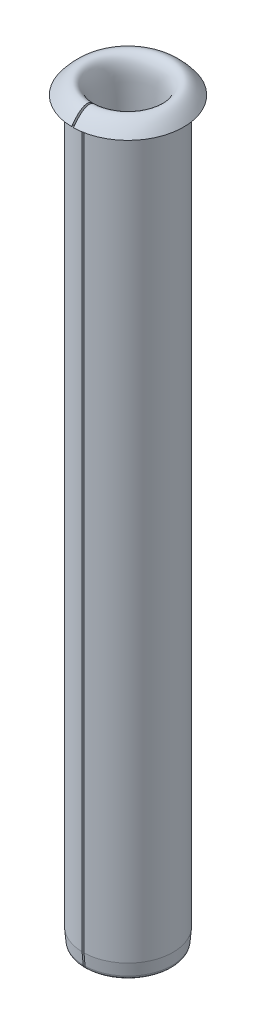
ISO-10303-21;
HEADER;
FILE_DESCRIPTION(('STEP AP214'),'2;1');
FILE_NAME('part.step','',(''),(''),'','','');
FILE_SCHEMA(('AUTOMOTIVE_DESIGN { 1 0 10303 214 1 1 1 1 }'));
ENDSEC;
DATA;
#1=APPLICATION_CONTEXT('core data for automotive mechanical design processes');
#2=APPLICATION_PROTOCOL_DEFINITION('international standard','automotive_design',2000,#1);
#3=PRODUCT_CONTEXT('',#1,'mechanical');
#4=PRODUCT('Part','Part','',(#3));
#5=PRODUCT_RELATED_PRODUCT_CATEGORY('part','',(#4));
#6=PRODUCT_DEFINITION_FORMATION('','',#4);
#7=PRODUCT_DEFINITION_CONTEXT('part definition',#1,'design');
#8=PRODUCT_DEFINITION('design','',#6,#7);
#9=PRODUCT_DEFINITION_SHAPE('','',#8);
#10=(LENGTH_UNIT() NAMED_UNIT(*) SI_UNIT(.MILLI.,.METRE.));
#11=(NAMED_UNIT(*) PLANE_ANGLE_UNIT() SI_UNIT($,.RADIAN.));
#12=(NAMED_UNIT(*) SI_UNIT($,.STERADIAN.) SOLID_ANGLE_UNIT());
#13=UNCERTAINTY_MEASURE_WITH_UNIT(LENGTH_MEASURE(1.E-05),#10,'distance_accuracy_value','');
#14=(GEOMETRIC_REPRESENTATION_CONTEXT(3) GLOBAL_UNCERTAINTY_ASSIGNED_CONTEXT((#13)) GLOBAL_UNIT_ASSIGNED_CONTEXT((#10,
#11,#12)) REPRESENTATION_CONTEXT('',''));
#15=CARTESIAN_POINT('',(0.,0.,0.));
#16=DIRECTION('',(0.,0.,1.));
#17=DIRECTION('',(1.,0.,0.));
#18=AXIS2_PLACEMENT_3D('',#15,#16,#17);
#19=CARTESIAN_POINT('',(0.,25.2095,0.));
#20=DIRECTION('',(0.,1.,0.));
#21=DIRECTION('',(0.,0.,1.));
#22=AXIS2_PLACEMENT_3D('',#19,#20,#21);
#23=CYLINDRICAL_SURFACE('',#22,1.9431);
#24=CARTESIAN_POINT('',(0.,6.0456438407686,0.));
#25=DIRECTION('',(0.,1.,0.));
#26=DIRECTION('',(0.,0.,1.));
#27=AXIS2_PLACEMENT_3D('',#24,#25,#26);
#28=CIRCLE('',#27,1.9431);
#29=CARTESIAN_POINT('',(0.0634999999999994,6.0456438407686,1.94206214112731));
#30=VERTEX_POINT('',#29);
#31=CARTESIAN_POINT('',(-0.0634999999999997,6.0456438407686,1.94206214112731));
#32=VERTEX_POINT('',#31);
#33=EDGE_CURVE('E141',#30,#32,#28,.T.);
#34=ORIENTED_EDGE('',*,*,#33,.T.);
#35=DIRECTION('',(0.,1.,0.));
#36=VECTOR('',#35,1.);
#37=CARTESIAN_POINT('',(-0.0634999999999998,25.2095,1.94206214112731));
#38=LINE('',#37,#36);
#39=CARTESIAN_POINT('',(-0.0634999999999998,-23.0505,1.94206214112731));
#40=VERTEX_POINT('',#39);
#41=EDGE_CURVE('E135',#32,#40,#38,.F.);
#42=ORIENTED_EDGE('',*,*,#41,.T.);
#43=CARTESIAN_POINT('',(0.,-23.0505,0.));
#44=DIRECTION('',(0.,1.,0.));
#45=DIRECTION('',(0.,0.,1.));
#46=AXIS2_PLACEMENT_3D('',#43,#44,#45);
#47=CIRCLE('',#46,1.9431);
#48=CARTESIAN_POINT('',(0.0634999999999998,-23.0505,1.94206214112731));
#49=VERTEX_POINT('',#48);
#50=EDGE_CURVE('E130',#49,#40,#47,.T.);
#51=ORIENTED_EDGE('',*,*,#50,.F.);
#52=DIRECTION('',(0.,1.,0.));
#53=VECTOR('',#52,1.);
#54=CARTESIAN_POINT('',(0.0634999999999998,25.2095,1.94206214112731));
#55=LINE('',#54,#53);
#56=EDGE_CURVE('E218',#49,#30,#55,.T.);
#57=ORIENTED_EDGE('',*,*,#56,.T.);
#58=EDGE_LOOP('',(#34,#42,#51,#57));
#59=FACE_BOUND('',#58,.T.);
#60=ADVANCED_FACE('F38',(#59),#23,.F.);
#61=CARTESIAN_POINT('',(0.,25.2095,-3.65125000000001));
#62=CARTESIAN_POINT('',(0.,26.5305018450348,-2.65729724700705));
#63=CARTESIAN_POINT('',(0.,25.8912896436103,-1.95569800395502));
#64=CARTESIAN_POINT('',(0.,23.1640789110681,-1.89109679939676));
#65=CARTESIAN_POINT('',(0.,10.0917514319737,-1.9431));
#66=CARTESIAN_POINT('',(0.,6.0456438407686,-1.9431));
#67=B_SPLINE_CURVE_WITH_KNOTS('',3,(#61,#62,#63,#64,#65,#66),.UNSPECIFIED.,.F.,.F.,(4,1,1,4),
(0.,0.384568444364939,0.484568444364939,1.),.UNSPECIFIED.);
#68=CARTESIAN_POINT('',(0.,25.2095,0.));
#69=DIRECTION('',(0.,1.,0.));
#70=AXIS1_PLACEMENT('',#68,#69);
#71=SURFACE_OF_REVOLUTION('',#67,#70);
#72=CARTESIAN_POINT('',(0.,25.2095,0.));
#73=DIRECTION('',(0.,1.,0.));
#74=DIRECTION('',(0.,0.,1.));
#75=AXIS2_PLACEMENT_3D('',#72,#73,#74);
#76=CIRCLE('',#75,3.65125000000001);
#77=CARTESIAN_POINT('',(0.0634999999999996,25.2095,3.65069778432837));
#78=VERTEX_POINT('',#77);
#79=CARTESIAN_POINT('',(-0.0634999999999996,25.2095,3.65069778432837));
#80=VERTEX_POINT('',#79);
#81=EDGE_CURVE('E132',#78,#80,#76,.T.);
#82=ORIENTED_EDGE('',*,*,#81,.T.);
#83=CARTESIAN_POINT('',(-0.0634999999999995,25.2095,3.65069778432837));
#84=CARTESIAN_POINT('',(-0.0634999999999995,25.2525849524079,3.61825117880372));
#85=CARTESIAN_POINT('',(-0.0634999999999996,25.2952226298447,3.5851866480371));
#86=CARTESIAN_POINT('',(-0.0634999999999996,25.3793649829865,3.51750900977395));
#87=CARTESIAN_POINT('',(-0.0634999999999996,25.4208676492833,3.48289341019141));
#88=CARTESIAN_POINT('',(-0.0634999999999996,25.5028989088239,3.4114342518473));
#89=CARTESIAN_POINT('',(-0.0634999999999996,25.5434071368236,3.37456714125441));
#90=CARTESIAN_POINT('',(-0.0634999999999996,25.6223281363604,3.29867997139376));
#91=CARTESIAN_POINT('',(-0.0634999999999997,25.6607421410328,3.25966120691164));
#92=CARTESIAN_POINT('',(-0.0634999999999998,25.7356207297132,3.17797016502465));
#93=CARTESIAN_POINT('',(-0.0634999999999998,25.7720134822132,3.13523134119888));
#94=CARTESIAN_POINT('',(-0.0634999999999995,25.8403306388767,3.04633730637982));
#95=CARTESIAN_POINT('',(-0.0634999999999991,25.8722632873164,3.00018864646711));
#96=CARTESIAN_POINT('',(-0.0634999999999992,25.9211540862807,2.91721765149556));
#97=CARTESIAN_POINT('',(-0.0634999999999995,25.9398009691219,2.88140544507021));
#98=CARTESIAN_POINT('',(-0.0634999999999998,25.971820238451,2.80743952086338));
#99=CARTESIAN_POINT('',(-0.0634999999999997,25.9852010817098,2.76928967194772));
#100=CARTESIAN_POINT('',(-0.0634999999999996,26.0011972019755,2.70386266707454));
#101=CARTESIAN_POINT('',(-0.0634999999999995,26.0059018201129,2.67710807746424));
#102=CARTESIAN_POINT('',(-0.0634999999999998,26.0109991786346,2.62322490734176));
#103=CARTESIAN_POINT('',(-0.0635000000000001,26.0114040857448,2.59609759971822));
#104=CARTESIAN_POINT('',(-0.0635000000000001,26.0072462853658,2.54192199657905));
#105=CARTESIAN_POINT('',(-0.0634999999999997,26.002633906891,2.5148771982149));
#106=CARTESIAN_POINT('',(-0.0634999999999997,25.9882439843716,2.46219860173665));
#107=CARTESIAN_POINT('',(-0.0635000000000002,25.9784672596926,2.43656458050346));
#108=CARTESIAN_POINT('',(-0.0635000000000001,25.9557863367476,2.39046939441756));
#109=CARTESIAN_POINT('',(-0.0634999999999996,25.9433866688396,2.36975465728549));
#110=CARTESIAN_POINT('',(-0.0634999999999998,25.9156963805078,2.33033224860946));
#111=CARTESIAN_POINT('',(-0.0635000000000005,25.9004012088773,2.31162781044834));
#112=CARTESIAN_POINT('',(-0.0635000000000004,25.870610702169,2.27951660875044));
#113=CARTESIAN_POINT('',(-0.0634999999999999,25.8564789726489,2.26576604256169));
#114=CARTESIAN_POINT('',(-0.0634999999999996,25.8270710059672,2.23958353453351));
#115=CARTESIAN_POINT('',(-0.0634999999999997,25.8117956502125,2.22715059467739));
#116=CARTESIAN_POINT('',(-0.0634999999999998,25.764535992816,2.19159190196874));
#117=CARTESIAN_POINT('',(-0.0634999999999996,25.7311868042261,2.17027654538413));
#118=CARTESIAN_POINT('',(-0.0634999999999995,25.6646186535501,2.13292443055379));
#119=CARTESIAN_POINT('',(-0.0634999999999997,25.631538040991,2.1166311739588));
#120=CARTESIAN_POINT('',(-0.0634999999999998,25.5640947720004,2.08688820051919));
#121=CARTESIAN_POINT('',(-0.0634999999999997,25.5297308630719,2.07344135186749));
#122=CARTESIAN_POINT('',(-0.0634999999999998,25.4600983263685,2.04892036747279));
#123=CARTESIAN_POINT('',(-0.0634999999999998,25.4248279283881,2.03785134360309));
#124=CARTESIAN_POINT('',(-0.0634999999999997,25.3537487796787,2.01777228881008));
#125=CARTESIAN_POINT('',(-0.0634999999999994,25.3179405698892,2.00876031966933));
#126=CARTESIAN_POINT('',(-0.0634999999999993,25.2380877277927,1.99074216630333));
#127=CARTESIAN_POINT('',(-0.0634999999999996,25.1939471145982,1.98216435869941));
#128=CARTESIAN_POINT('',(-0.0634999999999999,25.1052828108305,1.96726885746163));
#129=CARTESIAN_POINT('',(-0.0634999999999998,25.0607590409379,1.96095164392075));
#130=CARTESIAN_POINT('',(-0.0634999999999997,24.9713451488683,1.95034263206063));
#131=CARTESIAN_POINT('',(-0.0634999999999998,24.9264543395727,1.94605674425729));
#132=CARTESIAN_POINT('',(-0.0634999999999998,24.8365589307472,1.93902373514264));
#133=CARTESIAN_POINT('',(-0.0634999999999998,24.791554330034,1.93627662989744));
#134=CARTESIAN_POINT('',(-0.0634999999999998,24.7013981664918,1.9317706119025));
#135=CARTESIAN_POINT('',(-0.0634999999999998,24.6562465000686,1.93001392255642));
#136=CARTESIAN_POINT('',(-0.0634999999999998,24.5659256823257,1.92712303516122));
#137=CARTESIAN_POINT('',(-0.0634999999999998,24.5207565314535,1.92598882211287));
#138=CARTESIAN_POINT('',(-0.0634999999999998,24.3846555123278,1.92312565913346));
#139=CARTESIAN_POINT('',(-0.0634999999999998,24.2937127943944,1.92195797122578));
#140=CARTESIAN_POINT('',(-0.0634999999999998,24.1120349372313,1.92011850755025));
#141=CARTESIAN_POINT('',(-0.0634999999999998,24.021299804374,1.91944559107397));
#142=CARTESIAN_POINT('',(-0.0634999999999997,23.83991356424,1.91828148212774));
#143=CARTESIAN_POINT('',(-0.0634999999999995,23.7492624583271,1.91779011906913));
#144=CARTESIAN_POINT('',(-0.0634999999999991,23.3911754467131,1.9160897124077));
#145=CARTESIAN_POINT('',(-0.0634999999999996,23.1237376046809,1.91534978688922));
#146=CARTESIAN_POINT('',(-0.0634999999999999,22.5886398562582,1.91430458782529));
#147=CARTESIAN_POINT('',(-0.0634999999999998,22.320979949411,1.91399967480046));
#148=CARTESIAN_POINT('',(-0.0634999999999997,21.7855404400794,1.91366661833519));
#149=CARTESIAN_POINT('',(-0.0634999999999998,21.5177608375137,1.91363859853684));
#150=CARTESIAN_POINT('',(-0.0634999999999998,20.9821847515862,1.91376224115333));
#151=CARTESIAN_POINT('',(-0.0634999999999998,20.7143882682289,1.91391391494288));
#152=CARTESIAN_POINT('',(-0.0634999999999998,20.1802428983414,1.91434651629273));
#153=CARTESIAN_POINT('',(-0.0634999999999998,19.9138940112303,1.91462674078128));
#154=CARTESIAN_POINT('',(-0.0634999999999998,19.3812556738536,1.91528353444951));
#155=CARTESIAN_POINT('',(-0.0634999999999998,19.1149662235604,1.91566008216014));
#156=CARTESIAN_POINT('',(-0.0634999999999998,18.5824213337061,1.91648750278594));
#157=CARTESIAN_POINT('',(-0.0634999999999997,18.31616589413,1.91693836623478));
#158=CARTESIAN_POINT('',(-0.0634999999999998,17.7836636120618,1.91789836924967));
#159=CARTESIAN_POINT('',(-0.0634999999999999,17.5174167695663,1.91840750695684));
#160=CARTESIAN_POINT('',(-0.0635000000000001,16.6295029362049,1.9201809101271));
#161=CARTESIAN_POINT('',(-0.0634999999999999,16.0078361478196,1.92154591684627));
#162=CARTESIAN_POINT('',(-0.0634999999999997,14.7644501030037,1.92440676920792));
#163=CARTESIAN_POINT('',(-0.0634999999999998,14.1427308465996,1.92590262594889));
#164=CARTESIAN_POINT('',(-0.0634999999999998,12.8992789874935,1.92893677110839));
#165=CARTESIAN_POINT('',(-0.0634999999999998,12.2775463847936,1.93047506044404));
#166=CARTESIAN_POINT('',(-0.0634999999999998,11.0333152802993,1.93349906561809));
#167=CARTESIAN_POINT('',(-0.0634999999999999,10.4108167783492,1.93498471436939));
#168=CARTESIAN_POINT('',(-0.0634999999999997,9.16583274386796,1.93777194362577));
#169=CARTESIAN_POINT('',(-0.0634999999999994,8.54334721134674,1.93907352810096));
#170=CARTESIAN_POINT('',(-0.0634999999999999,7.60961846748299,1.94064911035104));
#171=CARTESIAN_POINT('',(-0.0635000000000003,7.29837557614109,1.94111150527148));
#172=CARTESIAN_POINT('',(-0.0634999999999993,6.67588954642258,1.94181593544022));
#173=CARTESIAN_POINT('',(-0.0634999999999979,6.36464640804604,1.94205797074307));
#174=CARTESIAN_POINT('',(-0.0634999999999996,6.05081678360277,1.94206212206388));
#175=CARTESIAN_POINT('',(-0.0634999999999996,6.04823031218615,1.94206213984736));
#176=CARTESIAN_POINT('',(-0.0634999999999996,6.0456438407686,1.94206214112731));
#177=B_SPLINE_CURVE_WITH_KNOTS('',3,(#83,#84,#85,#86,#87,#88,#89,#90,#91,#92,#93,#94,#95,#96,
#97,#98,#99,#100,#101,#102,#103,#104,#105,#106,#107,#108,#109,#110,#111,#112,#113,#114,#115,
#116,#117,#118,#119,#120,#121,#122,#123,#124,#125,#126,#127,#128,#129,#130,#131,#132,#133,#134,
#135,#136,#137,#138,#139,#140,#141,#142,#143,#144,#145,#146,#147,#148,#149,#150,#151,#152,#153,
#154,#155,#156,#157,#158,#159,#160,#161,#162,#163,#164,#165,#166,#167,#168,#169,#170,#171,#172,
#173,#174,#175,#176),.UNSPECIFIED.,.F.,.F.,(4,2,2,2,2,2,2,2,2,2,2,2,2,2,2,2,2,2,2,2,2,2,2,2,2,2,
2,2,2,2,2,2,2,2,2,2,2,2,2,2,2,2,2,2,2,2,4),(0.,0.161824296279905,0.323918633957974,
0.488174178949798,0.652331937362808,0.820554832350032,0.98846253983193,1.10932109193161,
1.22998475659452,1.3112033054825,1.39219197194098,1.47398978201144,1.55577461808952,
1.62791851627714,1.70017676754837,1.75924560817448,1.81826938330553,1.93660830891603,
2.04709059457147,2.15768368364099,2.26851219889892,2.37923585319993,2.51406433946752,
2.64892144292365,2.78416856489701,2.91941709893177,3.05496805822672,3.19051575113524,
3.46336022135094,3.73557365195228,4.00753065481241,4.80984626486723,5.61282641588422,
6.41616510815538,7.21955465498008,8.01860173328563,8.81747087046271,9.61623832617934,
10.4149803092783,12.2799851356634,14.1451483026871,16.0103518148328,17.8778526521344,
19.7453132029441,20.6790428935909,21.612772353051,21.620531767301),.UNSPECIFIED.);
#178=EDGE_CURVE('E187',#80,#32,#177,.T.);
#179=ORIENTED_EDGE('',*,*,#178,.T.);
#180=ORIENTED_EDGE('',*,*,#33,.F.);
#181=CARTESIAN_POINT('',(0.0634999999999994,6.0456438407686,1.94206214112731));
#182=CARTESIAN_POINT('',(0.0634999999999996,6.26142839064168,1.94205191839322));
#183=CARTESIAN_POINT('',(0.0634999999999997,6.47721288923427,1.94194044557862));
#184=CARTESIAN_POINT('',(0.0634999999999998,6.90879322370111,1.94157355286978));
#185=CARTESIAN_POINT('',(0.0634999999999998,7.1245890595692,1.94131812533561));
#186=CARTESIAN_POINT('',(0.0634999999999998,7.55618635058453,1.94072188184621));
#187=CARTESIAN_POINT('',(0.0634999999999998,7.77198780572833,1.94038106361655));
#188=CARTESIAN_POINT('',(0.0634999999999998,8.20315945125013,1.93963905837296));
#189=CARTESIAN_POINT('',(0.0634999999999998,8.41852964183793,1.9392379933331));
#190=CARTESIAN_POINT('',(0.0634999999999998,8.84926416643666,1.93839302559264));
#191=CARTESIAN_POINT('',(0.0634999999999998,9.06462850044988,1.9379491240402));
#192=CARTESIAN_POINT('',(0.0634999999999998,9.49534554722425,1.93703017584061));
#193=CARTESIAN_POINT('',(0.0634999999999998,9.71069825998898,1.9365551308657));
#194=CARTESIAN_POINT('',(0.0634999999999998,10.2438275043666,1.93535159216942));
#195=CARTESIAN_POINT('',(0.0634999999999998,10.5616040062742,1.93461001315689));
#196=CARTESIAN_POINT('',(0.0634999999999997,11.1971570935871,1.93309938792824));
#197=CARTESIAN_POINT('',(0.0634999999999998,11.5149336789924,1.9323303416992));
#198=CARTESIAN_POINT('',(0.0634999999999998,12.1505249861725,1.93078041806093));
#199=CARTESIAN_POINT('',(0.0634999999999998,12.4683397079437,1.92999953924187));
#200=CARTESIAN_POINT('',(0.0634999999999998,13.1040453342009,1.92843909613716));
#201=CARTESIAN_POINT('',(0.0634999999999998,13.4219362386877,1.92765953221146));
#202=CARTESIAN_POINT('',(0.0634999999999998,14.0588204438893,1.92611130484138));
#203=CARTESIAN_POINT('',(0.0634999999999998,14.3778137447194,1.92534268857145));
#204=CARTESIAN_POINT('',(0.0634999999999998,15.0157813781239,1.9238312762827));
#205=CARTESIAN_POINT('',(0.0634999999999998,15.3347557106947,1.92308847872628));
#206=CARTESIAN_POINT('',(0.0634999999999998,15.9725516198698,1.92164197665789));
#207=CARTESIAN_POINT('',(0.0634999999999998,16.2913731964319,1.92093825358409));
#208=CARTESIAN_POINT('',(0.0634999999999997,16.9287298107224,1.91958498239687));
#209=CARTESIAN_POINT('',(0.0634999999999997,17.2472648483476,1.91893538614341));
#210=CARTESIAN_POINT('',(0.0634999999999997,17.7786914939258,1.91791164565359));
#211=CARTESIAN_POINT('',(0.0634999999999997,17.9915830634393,1.91751759864989));
#212=CARTESIAN_POINT('',(0.0634999999999998,18.4173264573173,1.91676864742645));
#213=CARTESIAN_POINT('',(0.0634999999999998,18.6301782816688,1.91641373590011));
#214=CARTESIAN_POINT('',(0.0634999999999998,19.0559891710489,1.91575129292527));
#215=CARTESIAN_POINT('',(0.0634999999999998,19.268948236115,1.91544378542151));
#216=CARTESIAN_POINT('',(0.0634999999999998,19.6951205964093,1.9148869625135));
#217=CARTESIAN_POINT('',(0.0634999999999998,19.9083338917301,1.91463771699563));
#218=CARTESIAN_POINT('',(0.0634999999999998,20.3351617071919,1.91421213030313));
#219=CARTESIAN_POINT('',(0.0634999999999998,20.5487762274739,1.91403592717659));
#220=CARTESIAN_POINT('',(0.0634999999999998,20.9765534981113,1.9137772531788));
#221=CARTESIAN_POINT('',(0.0634999999999998,21.1907162486241,1.91369502399973));
#222=CARTESIAN_POINT('',(0.0634999999999998,21.6173445732125,1.91365621192292));
#223=CARTESIAN_POINT('',(0.0634999999999998,21.8298101471612,1.91369863847034));
#224=CARTESIAN_POINT('',(0.0634999999999998,22.2548673283202,1.91395432536414));
#225=CARTESIAN_POINT('',(0.0634999999999998,22.4674589354843,1.91416768709569));
#226=CARTESIAN_POINT('',(0.0634999999999998,22.7861754975254,1.91468250933342));
#227=CARTESIAN_POINT('',(0.0634999999999998,22.8923006039213,1.91488633804314));
#228=CARTESIAN_POINT('',(0.0634999999999998,23.1045585602737,1.91537955491552));
#229=CARTESIAN_POINT('',(0.0634999999999998,23.2106914102147,1.91566894948504));
#230=CARTESIAN_POINT('',(0.0634999999999998,23.4225707626645,1.91635852820717));
#231=CARTESIAN_POINT('',(0.0634999999999998,23.5283172662837,1.91675830555074));
#232=CARTESIAN_POINT('',(0.0634999999999998,23.7397796751577,1.91773272725248));
#233=CARTESIAN_POINT('',(0.0634999999999998,23.8454955806723,1.91830732251194));
#234=CARTESIAN_POINT('',(0.0634999999999998,24.0562537508886,1.91968573396833));
#235=CARTESIAN_POINT('',(0.0634999999999998,24.1612960213422,1.92048806821929));
#236=CARTESIAN_POINT('',(0.0634999999999998,24.3189110351805,1.92235634345558));
#237=CARTESIAN_POINT('',(0.0634999999999998,24.3714873701586,1.92309049394019));
#238=CARTESIAN_POINT('',(0.0634999999999998,24.4766320782228,1.92498213330282));
#239=CARTESIAN_POINT('',(0.0634999999999998,24.5292004514474,1.92613961368965));
#240=CARTESIAN_POINT('',(0.0634999999999998,24.6341096880838,1.92919841755265));
#241=CARTESIAN_POINT('',(0.0634999999999998,24.6864506308347,1.93109678829574));
#242=CARTESIAN_POINT('',(0.0634999999999998,24.7910785113376,1.93618944092617));
#243=CARTESIAN_POINT('',(0.0634999999999998,24.8433654463715,1.93938378513094));
#244=CARTESIAN_POINT('',(0.0634999999999997,24.947666763851,1.94793731143381));
#245=CARTESIAN_POINT('',(0.0634999999999996,24.999681483895,1.95329209346519));
#246=CARTESIAN_POINT('',(0.0634999999999999,25.1033306348079,1.96685643207269));
#247=CARTESIAN_POINT('',(0.0635000000000003,25.1549651923697,1.97506498912529));
#248=CARTESIAN_POINT('',(0.0635000000000002,25.2459655011043,1.9924848798767));
#249=CARTESIAN_POINT('',(0.0634999999999999,25.2854555677648,2.00104559334645));
#250=CARTESIAN_POINT('',(0.0634999999999996,25.3639009571113,2.02041602631641));
#251=CARTESIAN_POINT('',(0.0634999999999997,25.4028561299798,2.03122636274389));
#252=CARTESIAN_POINT('',(0.0634999999999998,25.4796374711998,2.05539388410212));
#253=CARTESIAN_POINT('',(0.0634999999999997,25.5174701707079,2.06873004400392));
#254=CARTESIAN_POINT('',(0.0634999999999998,25.5918826107723,2.09852800129229));
#255=CARTESIAN_POINT('',(0.0634999999999999,25.6284631888146,2.11498765931306));
#256=CARTESIAN_POINT('',(0.0634999999999999,25.6941245222759,2.14888170084357));
#257=CARTESIAN_POINT('',(0.0634999999999998,25.7234860016539,2.16576499228166));
#258=CARTESIAN_POINT('',(0.0634999999999996,25.7801936194125,2.20285786951519));
#259=CARTESIAN_POINT('',(0.0634999999999995,25.8075337797988,2.22307679187564));
#260=CARTESIAN_POINT('',(0.0634999999999995,25.8593412016956,2.26767036354344));
#261=CARTESIAN_POINT('',(0.0634999999999996,25.8837631535031,2.29209896392457));
#262=CARTESIAN_POINT('',(0.0634999999999998,25.9274377135438,2.34516475580662));
#263=CARTESIAN_POINT('',(0.0635,25.9467132234815,2.37378239386048));
#264=CARTESIAN_POINT('',(0.0634999999999999,25.9736141600363,2.42580063425303));
#265=CARTESIAN_POINT('',(0.0634999999999998,25.9829975861474,2.44829348819886));
#266=CARTESIAN_POINT('',(0.0634999999999996,25.9977553303156,2.49456826325224));
#267=CARTESIAN_POINT('',(0.0634999999999994,26.0031296336511,2.51835018909294));
#268=CARTESIAN_POINT('',(0.0634999999999995,26.0097881315932,2.56637746769456));
#269=CARTESIAN_POINT('',(0.0634999999999997,26.011086643669,2.59062089656799));
#270=CARTESIAN_POINT('',(0.0634999999999996,26.0099893349643,2.63904367064995));
#271=CARTESIAN_POINT('',(0.0634999999999992,26.0075871761546,2.66322283471215));
#272=CARTESIAN_POINT('',(0.0634999999999992,26.0005310194621,2.70572657852547));
#273=CARTESIAN_POINT('',(0.0634999999999995,25.9964946557931,2.72416020305386));
#274=CARTESIAN_POINT('',(0.0634999999999998,25.9868084188891,2.76057518304673));
#275=CARTESIAN_POINT('',(0.0634999999999997,25.9811599410521,2.77855691507324));
#276=CARTESIAN_POINT('',(0.0634999999999995,25.9621428901579,2.83186821025163));
#277=CARTESIAN_POINT('',(0.0634999999999993,25.9467213781844,2.86646696740451));
#278=CARTESIAN_POINT('',(0.0634999999999994,25.9128657763392,2.93207047729133));
#279=CARTESIAN_POINT('',(0.0634999999999996,25.8946030171072,2.96316735437221));
#280=CARTESIAN_POINT('',(0.0634999999999997,25.8555197125399,3.02373317569636));
#281=CARTESIAN_POINT('',(0.0634999999999997,25.8346968712834,3.05320062380452));
#282=CARTESIAN_POINT('',(0.0634999999999996,25.7910447706926,3.11081194188255));
#283=CARTESIAN_POINT('',(0.0634999999999995,25.7682064963171,3.13894890042186));
#284=CARTESIAN_POINT('',(0.0634999999999998,25.721043156095,3.19395230671774));
#285=CARTESIAN_POINT('',(0.0635000000000002,25.6967176588511,3.2208183817837));
#286=CARTESIAN_POINT('',(0.0635000000000004,25.6362241286939,3.28471792915157));
#287=CARTESIAN_POINT('',(0.0634999999999998,25.5994484635684,3.32117456952873));
#288=CARTESIAN_POINT('',(0.0634999999999994,25.5241207924662,3.39222881937241));
#289=CARTESIAN_POINT('',(0.0634999999999995,25.4855677862151,3.42682535766596));
#290=CARTESIAN_POINT('',(0.0634999999999996,25.4079654975923,3.49370287922068));
#291=CARTESIAN_POINT('',(0.0634999999999995,25.3689453899934,3.52601791252398));
#292=CARTESIAN_POINT('',(0.0634999999999996,25.2899149435186,3.58930197614371));
#293=CARTESIAN_POINT('',(0.0634999999999997,25.249906049678,3.62027280721739));
#294=CARTESIAN_POINT('',(0.0635000000000002,25.2095,3.65069778432837));
#295=B_SPLINE_CURVE_WITH_KNOTS('',3,(#181,#182,#183,#184,#185,#186,#187,#188,#189,#190,#191,
#192,#193,#194,#195,#196,#197,#198,#199,#200,#201,#202,#203,#204,#205,#206,#207,#208,#209,#210,
#211,#212,#213,#214,#215,#216,#217,#218,#219,#220,#221,#222,#223,#224,#225,#226,#227,#228,#229,
#230,#231,#232,#233,#234,#235,#236,#237,#238,#239,#240,#241,#242,#243,#244,#245,#246,#247,#248,
#249,#250,#251,#252,#253,#254,#255,#256,#257,#258,#259,#260,#261,#262,#263,#264,#265,#266,#267,
#268,#269,#270,#271,#272,#273,#274,#275,#276,#277,#278,#279,#280,#281,#282,#283,#284,#285,#286,
#287,#288,#289,#290,#291,#292,#293,#294),.UNSPECIFIED.,.F.,.F.,(4,2,2,2,2,2,2,2,2,2,2,2,2,2,2,2,
2,2,2,2,2,2,2,2,2,2,2,2,2,2,2,2,2,2,2,2,2,2,2,2,2,2,2,2,2,2,2,2,2,2,2,2,2,2,2,2,4),(0.,
0.647353561046854,1.29474148150864,1.94214664729908,2.58825833221972,3.23435270404255,
3.88041241252025,4.83374451170952,5.7870770592595,6.74052410250829,7.69419968350228,
8.65118236341234,9.60810795413671,10.5645750107614,11.5201821040428,12.1588579037902,
12.7974142601725,13.4362921150221,14.0759324280112,14.7167761915527,15.3592644619764,
15.9966611548767,16.6344361809753,16.9528120554031,17.2712117746863,17.5884533634236,
17.9056059349858,18.2207402648713,18.3784838322096,18.5362242356854,18.6933422991795,
18.8504679186597,19.0072751299618,19.1640274753904,19.2851966673964,19.4063991322324,
19.5266338321926,19.64678647556,19.7482253611895,19.8499531516997,19.9530975905711,
20.0557750824146,20.1285506760304,20.2013265368791,20.2738464623919,20.3464907287784,
20.4030224634179,20.4595054135073,20.5727638762202,20.6808093794262,20.7889524961642,
20.8976065651428,21.0062923022118,21.1615551279921,21.31690642749,21.4688686416659,
21.6206205658776),.UNSPECIFIED.);
#296=EDGE_CURVE('E210',#30,#78,#295,.T.);
#297=ORIENTED_EDGE('',*,*,#296,.T.);
#298=EDGE_LOOP('',(#82,#179,#180,#297));
#299=FACE_BOUND('',#298,.T.);
#300=ADVANCED_FACE('F196',(#299),#71,.T.);
#301=CARTESIAN_POINT('',(0.,25.2095,-3.20458453955676));
#302=DIRECTION('',(0.,1.,0.));
#303=DIRECTION('',(0.,0.,1.));
#304=AXIS2_PLACEMENT_3D('',#301,#302,#303);
#305=PLANE('',#304);
#306=CARTESIAN_POINT('',(0.,25.2095,0.));
#307=DIRECTION('',(0.,1.,0.));
#308=DIRECTION('',(0.,0.,1.));
#309=AXIS2_PLACEMENT_3D('',#306,#307,#308);
#310=CIRCLE('',#309,3.20458453955676);
#311=CARTESIAN_POINT('',(0.0634999999999996,25.2095000000205,3.20395534006758));
#312=VERTEX_POINT('',#311);
#313=CARTESIAN_POINT('',(-0.0634999999999996,25.2095,3.20395534007048));
#314=VERTEX_POINT('',#313);
#315=EDGE_CURVE('E123',#312,#314,#310,.T.);
#316=ORIENTED_EDGE('',*,*,#315,.T.);
#317=DIRECTION('',(0.,0.,1.));
#318=VECTOR('',#317,1.);
#319=CARTESIAN_POINT('',(-0.0635000000000004,25.2095,-3.20458453955676));
#320=LINE('',#319,#318);
#321=EDGE_CURVE('E195',#314,#80,#320,.T.);
#322=ORIENTED_EDGE('',*,*,#321,.T.);
#323=ORIENTED_EDGE('',*,*,#81,.F.);
#324=DIRECTION('',(0.,0.,-1.));
#325=VECTOR('',#324,1.);
#326=CARTESIAN_POINT('',(0.0635000000000004,25.2095,-3.20458453955676));
#327=LINE('',#326,#325);
#328=EDGE_CURVE('E124',#78,#312,#327,.T.);
#329=ORIENTED_EDGE('',*,*,#328,.T.);
#330=EDGE_LOOP('',(#316,#322,#323,#329));
#331=FACE_BOUND('',#330,.T.);
#332=ADVANCED_FACE('F200',(#331),#305,.F.);
#333=CARTESIAN_POINT('',(0.,24.9555,0.));
#334=DIRECTION('',(0.,1.,0.));
#335=DIRECTION('',(0.,0.,1.));
#336=AXIS2_PLACEMENT_3D('',#333,#334,#335);
#337=TOROIDAL_SURFACE('',#336,3.20458453955676,0.254);
#338=CARTESIAN_POINT('',(0.,24.9555,0.));
#339=DIRECTION('',(0.,1.,0.));
#340=DIRECTION('',(0.,0.,1.));
#341=AXIS2_PLACEMENT_3D('',#338,#339,#340);
#342=CIRCLE('',#341,2.95058453955676);
#343=CARTESIAN_POINT('',(0.0634999999999996,24.9555,2.94990116361063));
#344=VERTEX_POINT('',#343);
#345=CARTESIAN_POINT('',(-0.0634999999999996,24.9555,2.94990116361063));
#346=VERTEX_POINT('',#345);
#347=EDGE_CURVE('E121',#344,#346,#342,.T.);
#348=ORIENTED_EDGE('',*,*,#347,.T.);
#349=CARTESIAN_POINT('',(-0.0634999999999996,25.0081375151706,2.955416439005));
#350=CARTESIAN_POINT('',(-0.0634999999999996,25.022093788553,2.95837416696398));
#351=CARTESIAN_POINT('',(-0.0634999999999996,25.0358104296924,2.96251280714055));
#352=CARTESIAN_POINT('',(-0.0634999999999996,25.0623654268699,2.97303807599447));
#353=CARTESIAN_POINT('',(-0.0634999999999996,25.0752027040794,2.97942740890873));
#354=CARTESIAN_POINT('',(-0.0634999999999996,25.0996170470811,2.99426840641064));
#355=CARTESIAN_POINT('',(-0.0634999999999996,25.1111947215229,3.00271906849099));
#356=CARTESIAN_POINT('',(-0.0634999999999996,25.132763978181,3.02144168115919));
#357=CARTESIAN_POINT('',(-0.0634999999999996,25.1427559532012,3.03171317935704));
#358=CARTESIAN_POINT('',(-0.0634999999999996,25.1608768133097,3.05379017064003));
#359=CARTESIAN_POINT('',(-0.0634999999999996,25.1690052277993,3.06559605002047));
#360=CARTESIAN_POINT('',(-0.0634999999999996,25.1831654166182,3.09040512543139));
#361=CARTESIAN_POINT('',(-0.0634999999999996,25.1891971062721,3.1034083697901));
#362=CARTESIAN_POINT('',(-0.0634999999999996,25.1989933513294,3.13024524931404));
#363=CARTESIAN_POINT('',(-0.0634999999999996,25.2027574872211,3.14407903761481));
#364=CARTESIAN_POINT('',(-0.0634999999999996,25.2079101197101,3.1721821552278));
#365=CARTESIAN_POINT('',(-0.0634999999999996,25.2092986192238,3.18645148400529));
#366=CARTESIAN_POINT('',(-0.0634999999999996,25.2096606148805,3.21502236651515));
#367=CARTESIAN_POINT('',(-0.0634999999999996,25.2086338376143,3.22932392371269));
#368=CARTESIAN_POINT('',(-0.0634999999999996,25.2041937884572,3.25755163634632));
#369=CARTESIAN_POINT('',(-0.0634999999999996,25.2007805207059,3.27147779243356));
#370=CARTESIAN_POINT('',(-0.0634999999999996,25.1916643507719,3.2985590789059));
#371=CARTESIAN_POINT('',(-0.0634999999999996,25.1859614929289,3.31171422421664));
#372=CARTESIAN_POINT('',(-0.0634999999999996,25.1724278813424,3.33688021170918));
#373=CARTESIAN_POINT('',(-0.0634999999999996,25.1645971265421,3.34889105332269));
#374=CARTESIAN_POINT('',(-0.0634999999999996,25.1470310433673,3.37142578912795));
#375=CARTESIAN_POINT('',(-0.0634999999999996,25.1372959586088,3.38194987322049));
#376=CARTESIAN_POINT('',(-0.0634999999999996,25.1161968516298,3.40121393224639));
#377=CARTESIAN_POINT('',(-0.0634999999999996,25.1048328315454,3.40995390951929));
#378=CARTESIAN_POINT('',(-0.0634999999999996,25.0808005556572,3.42540005107075));
#379=CARTESIAN_POINT('',(-0.0634999999999996,25.0681325264289,3.43210656787296));
#380=CARTESIAN_POINT('',(-0.0634999999999996,25.0418502203103,3.443297264092));
#381=CARTESIAN_POINT('',(-0.0634999999999996,25.0282359441322,3.44778144518179));
#382=CARTESIAN_POINT('',(-0.0634999999999996,25.000449815553,3.45439952580722));
#383=CARTESIAN_POINT('',(-0.0634999999999996,24.9862780472808,3.45653377856297));
#384=CARTESIAN_POINT('',(-0.0634999999999996,24.9577773549159,3.45839256045434));
#385=CARTESIAN_POINT('',(-0.0634999999999996,24.943448430916,3.45811709101428));
#386=CARTESIAN_POINT('',(-0.0634999999999996,24.9150412932183,3.4551643689104));
#387=CARTESIAN_POINT('',(-0.0634999999999996,24.9009630611796,3.45248729269176));
#388=CARTESIAN_POINT('',(-0.0634999999999996,24.8734558415046,3.4448076659952));
#389=CARTESIAN_POINT('',(-0.0634999999999996,24.8600268538818,3.43980511546922));
#390=CARTESIAN_POINT('',(-0.0634999999999996,24.8341988889653,3.42761648269077));
#391=CARTESIAN_POINT('',(-0.0634999999999996,24.8217999404555,3.42043033944486));
#392=CARTESIAN_POINT('',(-0.0634999999999996,24.7983842919856,3.40407868049274));
#393=CARTESIAN_POINT('',(-0.0634999999999996,24.7873675925537,3.39491316403006));
#394=CARTESIAN_POINT('',(-0.0634999999999996,24.7670277184229,3.37486180575879));
#395=CARTESIAN_POINT('',(-0.0634999999999996,24.7577047469498,3.36397575780084));
#396=CARTESIAN_POINT('',(-0.0634999999999996,24.7410183656945,3.34079320297014));
#397=CARTESIAN_POINT('',(-0.0634999999999996,24.7336549584489,3.32849669427161));
#398=CARTESIAN_POINT('',(-0.0634999999999996,24.7210953921697,3.30284003179502));
#399=CARTESIAN_POINT('',(-0.0634999999999996,24.7158996046033,3.28947969617463));
#400=CARTESIAN_POINT('',(-0.0634999999999996,24.7078243919652,3.26207645318852));
#401=CARTESIAN_POINT('',(-0.0634999999999996,24.7049449666454,3.24803354589589));
#402=CARTESIAN_POINT('',(-0.0634999999999996,24.7015837955332,3.21966141844754));
#403=CARTESIAN_POINT('',(-0.0634999999999996,24.7011024267108,3.20533215363239));
#404=CARTESIAN_POINT('',(-0.0634999999999996,24.7025520004129,3.17679613440125));
#405=CARTESIAN_POINT('',(-0.0634999999999996,24.7044829487688,3.16258938028151));
#406=CARTESIAN_POINT('',(-0.0634999999999996,24.7107026176725,3.13470061164647));
#407=CARTESIAN_POINT('',(-0.0634999999999996,24.7149915113394,3.12101863573902));
#408=CARTESIAN_POINT('',(-0.0634999999999996,24.7258055556178,3.09456894566013));
#409=CARTESIAN_POINT('',(-0.0634999999999996,24.7323307105695,3.08180123326316));
#410=CARTESIAN_POINT('',(-0.0634999999999996,24.747431919295,3.05754308655386));
#411=CARTESIAN_POINT('',(-0.0634999999999996,24.7560079050776,3.04605260991577));
#412=CARTESIAN_POINT('',(-0.0634999999999996,24.7749672302533,3.02467529820173));
#413=CARTESIAN_POINT('',(-0.0634999999999996,24.7853504972183,3.01478839889181));
#414=CARTESIAN_POINT('',(-0.0634999999999996,24.8076267171435,2.99690111672282));
#415=CARTESIAN_POINT('',(-0.0634999999999996,24.8195192542592,2.98890021594905));
#416=CARTESIAN_POINT('',(-0.0634999999999996,24.8444823771341,2.9750071167593));
#417=CARTESIAN_POINT('',(-0.0634999999999996,24.8575532536431,2.96911544057739));
#418=CARTESIAN_POINT('',(-0.0634999999999996,24.8845009684954,2.95960971431558));
#419=CARTESIAN_POINT('',(-0.0634999999999996,24.8983780167978,2.95599626050604));
#420=CARTESIAN_POINT('',(-0.0634999999999996,24.9265304510039,2.95115594284414));
#421=CARTESIAN_POINT('',(-0.0634999999999996,24.9408053369518,2.94992620944927));
#422=CARTESIAN_POINT('',(-0.0634999999999996,24.9639828870113,2.94988610605909));
#423=CARTESIAN_POINT('',(-0.0634999999999996,24.9728906285173,2.95034081746797));
#424=CARTESIAN_POINT('',(-0.0634999999999996,24.9906092493838,2.95218225397814));
#425=CARTESIAN_POINT('',(-0.0634999999999996,24.9994201287574,2.9535689789548));
#426=CARTESIAN_POINT('',(-0.0634999999999996,25.0081375151706,2.955416439005));
#427=B_SPLINE_CURVE_WITH_KNOTS('',3,(#349,#350,#351,#352,#353,#354,#355,#356,#357,#358,#359,
#360,#361,#362,#363,#364,#365,#366,#367,#368,#369,#370,#371,#372,#373,#374,#375,#376,#377,#378,
#379,#380,#381,#382,#383,#384,#385,#386,#387,#388,#389,#390,#391,#392,#393,#394,#395,#396,#397,
#398,#399,#400,#401,#402,#403,#404,#405,#406,#407,#408,#409,#410,#411,#412,#413,#414,#415,#416,
#417,#418,#419,#420,#421,#422,#423,#424,#425,#426),.UNSPECIFIED.,.T.,.F.,(4,2,2,2,2,2,2,2,2,2,2,
2,2,2,2,2,2,2,2,2,2,2,2,2,2,2,2,2,2,2,2,2,2,2,2,2,2,2,4),(0.,0.0427661998827339,
0.0855839601743477,0.128380937840822,0.171167297385957,0.213964449752857,0.256763330262267,
0.299570126401557,0.34237686998828,0.38518845952665,0.427999974801451,0.470810661034487,
0.513621368528289,0.556426602936066,0.599231781211937,0.642029534471407,0.684827255512739,
0.727618542706964,0.770409804608836,0.813197922909694,0.855986042094714,0.89877535657359,
0.941564687405791,0.984359149030513,1.02715366605131,1.06995551380345,1.11275735697253,
1.1555659283013,1.1983746031172,1.24118642134271,1.28399832265769,1.32680880482398,
1.36961757172127,1.41241456915737,1.45522215561178,1.49804094128525,1.54080814925781,
1.5675208346173,1.59423351640483),.UNSPECIFIED.);
#428=EDGE_CURVE('E178',#346,#314,#427,.T.);
#429=ORIENTED_EDGE('',*,*,#428,.T.);
#430=ORIENTED_EDGE('',*,*,#315,.F.);
#431=CARTESIAN_POINT('',(0.0634999999999996,25.0081375151706,2.955416439005));
#432=CARTESIAN_POINT('',(0.0634999999999996,24.9941829154114,2.95246036000837));
#433=CARTESIAN_POINT('',(0.0634999999999996,24.9799685126455,2.950680576464));
#434=CARTESIAN_POINT('',(0.0634999999999996,24.9514308289353,2.94953158996831));
#435=CARTESIAN_POINT('',(0.0634999999999996,24.9371074375657,2.95016529004137));
#436=CARTESIAN_POINT('',(0.0634999999999996,24.9087760133567,2.95382868308487));
#437=CARTESIAN_POINT('',(0.0634999999999996,24.8947678329077,2.95685722950583));
#438=CARTESIAN_POINT('',(0.0634999999999996,24.8674626089441,2.96522231138955));
#439=CARTESIAN_POINT('',(0.0634999999999996,24.854165389954,2.97055827436613));
#440=CARTESIAN_POINT('',(0.0634999999999996,24.8286531820279,2.98338729511628));
#441=CARTESIAN_POINT('',(0.0634999999999996,24.8164383557389,2.99088067636027));
#442=CARTESIAN_POINT('',(0.0634999999999996,24.7934393511444,3.00781172344678));
#443=CARTESIAN_POINT('',(0.0634999999999996,24.7826552301373,3.01724946712043));
#444=CARTESIAN_POINT('',(0.0634999999999996,24.7628223434228,3.03780275435016));
#445=CARTESIAN_POINT('',(0.0634999999999996,24.7537738640358,3.04891857419055));
#446=CARTESIAN_POINT('',(0.0634999999999996,24.7376710664233,3.07251125791881));
#447=CARTESIAN_POINT('',(0.0634999999999996,24.7306167466021,3.08498812071748));
#448=CARTESIAN_POINT('',(0.0634999999999996,24.7187009343164,3.11095161345151));
#449=CARTESIAN_POINT('',(0.0634999999999996,24.7138399132021,3.12443845971165));
#450=CARTESIAN_POINT('',(0.0634999999999996,24.7064507650659,3.15203673561193));
#451=CARTESIAN_POINT('',(0.0634999999999996,24.7039226359342,3.1661481646872));
#452=CARTESIAN_POINT('',(0.0634999999999996,24.7012707713813,3.19459716005883));
#453=CARTESIAN_POINT('',(0.0634999999999996,24.7011473717906,3.20893475766075));
#454=CARTESIAN_POINT('',(0.0634999999999996,24.7033093657925,3.23742719514682));
#455=CARTESIAN_POINT('',(0.0634999999999996,24.7055947625167,3.25158203479336));
#456=CARTESIAN_POINT('',(0.0634999999999996,24.7125096228853,3.27930725993982));
#457=CARTESIAN_POINT('',(0.0634999999999996,24.7171391125012,3.29287763896239));
#458=CARTESIAN_POINT('',(0.0634999999999996,24.7286108912923,3.31904843245001));
#459=CARTESIAN_POINT('',(0.0634999999999996,24.7354531786211,3.3316488477244));
#460=CARTESIAN_POINT('',(0.0634999999999996,24.7511556016399,3.35552055692653));
#461=CARTESIAN_POINT('',(0.0634999999999996,24.7600155225284,3.36679199214657));
#462=CARTESIAN_POINT('',(0.0634999999999996,24.7795022174045,3.38768711188009));
#463=CARTESIAN_POINT('',(0.0634999999999996,24.7901289901088,3.39731079759036));
#464=CARTESIAN_POINT('',(0.0634999999999996,24.8128458052046,3.41463548824189));
#465=CARTESIAN_POINT('',(0.0634999999999996,24.8249355997863,3.4223368181208));
#466=CARTESIAN_POINT('',(0.0634999999999996,24.8502366972543,3.4356000820964));
#467=CARTESIAN_POINT('',(0.0634999999999996,24.8634479990571,3.44116201826004));
#468=CARTESIAN_POINT('',(0.0634999999999996,24.8906147843542,3.44998770606539));
#469=CARTESIAN_POINT('',(0.0634999999999996,24.9045701472655,3.45325182888204));
#470=CARTESIAN_POINT('',(0.0634999999999996,24.9328308104497,3.45739059080171));
#471=CARTESIAN_POINT('',(0.0634999999999996,24.9471361105114,3.45826523134733));
#472=CARTESIAN_POINT('',(0.0634999999999996,24.975689113525,3.45760020673874));
#473=CARTESIAN_POINT('',(0.0634999999999996,24.9899368218273,3.4560607712766));
#474=CARTESIAN_POINT('',(0.0634999999999996,25.0179715578625,3.45061176725592));
#475=CARTESIAN_POINT('',(0.0634999999999996,25.0317585857277,3.4467021993783));
#476=CARTESIAN_POINT('',(0.0634999999999996,25.0584806751544,3.43662399001467));
#477=CARTESIAN_POINT('',(0.0634999999999996,25.0714157339969,3.43045534131964));
#478=CARTESIAN_POINT('',(0.0634999999999996,25.0960667751738,3.41603419443618));
#479=CARTESIAN_POINT('',(0.0634999999999996,25.1077827565354,3.40778169458467));
#480=CARTESIAN_POINT('',(0.0634999999999996,25.1296643653012,3.38942627114691));
#481=CARTESIAN_POINT('',(0.0634999999999996,25.1398298358951,3.37932316062674));
#482=CARTESIAN_POINT('',(0.0634999999999996,25.1583206515479,3.35755395841621));
#483=CARTESIAN_POINT('',(0.0634999999999996,25.1666459970356,3.34588786709));
#484=CARTESIAN_POINT('',(0.0634999999999996,25.1812217119749,3.32132182688819));
#485=CARTESIAN_POINT('',(0.0634999999999996,25.187471741579,3.30842167637183));
#486=CARTESIAN_POINT('',(0.0634999999999996,25.1977177644992,3.28175528115297));
#487=CARTESIAN_POINT('',(0.0634999999999996,25.2017137515602,3.26798903404709));
#488=CARTESIAN_POINT('',(0.0634999999999996,25.2073388909592,3.23997880898995));
#489=CARTESIAN_POINT('',(0.0634999999999996,25.2089676518693,3.22573475242977));
#490=CARTESIAN_POINT('',(0.0634999999999996,25.2098109478733,3.19717532023204));
#491=CARTESIAN_POINT('',(0.0634999999999996,25.2090254763766,3.1828599443999));
#492=CARTESIAN_POINT('',(0.0634999999999996,25.2050623696114,3.15456249684322));
#493=CARTESIAN_POINT('',(0.0634999999999996,25.2018844496339,3.140580464992));
#494=CARTESIAN_POINT('',(0.0634999999999996,25.1932263901061,3.11334893783307));
#495=CARTESIAN_POINT('',(0.0634999999999996,25.1877463406384,3.10009941388525));
#496=CARTESIAN_POINT('',(0.0634999999999996,25.1746404123478,3.07471013089391));
#497=CARTESIAN_POINT('',(0.0634999999999996,25.1670148008926,3.06257023382466));
#498=CARTESIAN_POINT('',(0.0634999999999996,25.149831121851,3.03974006557202));
#499=CARTESIAN_POINT('',(0.0634999999999996,25.1402725756215,3.02905015453905));
#500=CARTESIAN_POINT('',(0.0634999999999996,25.1194938433395,3.00942466901083));
#501=CARTESIAN_POINT('',(0.0634999999999996,25.1082731080171,3.00048967670663));
#502=CARTESIAN_POINT('',(0.0634999999999996,25.0844988856811,2.98464011056339));
#503=CARTESIAN_POINT('',(0.0634999999999996,25.0719470201621,2.97772311621689));
#504=CARTESIAN_POINT('',(0.0634999999999996,25.0507695292965,2.96827978538415));
#505=CARTESIAN_POINT('',(0.0634999999999996,25.0424373690113,2.96507975614877));
#506=CARTESIAN_POINT('',(0.0634999999999996,25.0254831545809,2.95957206533677));
#507=CARTESIAN_POINT('',(0.0634999999999996,25.0168611004649,2.95726440366961));
#508=CARTESIAN_POINT('',(0.0634999999999996,25.0081375151706,2.955416439005));
#509=B_SPLINE_CURVE_WITH_KNOTS('',3,(#431,#432,#433,#434,#435,#436,#437,#438,#439,#440,#441,
#442,#443,#444,#445,#446,#447,#448,#449,#450,#451,#452,#453,#454,#455,#456,#457,#458,#459,#460,
#461,#462,#463,#464,#465,#466,#467,#468,#469,#470,#471,#472,#473,#474,#475,#476,#477,#478,#479,
#480,#481,#482,#483,#484,#485,#486,#487,#488,#489,#490,#491,#492,#493,#494,#495,#496,#497,#498,
#499,#500,#501,#502,#503,#504,#505,#506,#507,#508),.UNSPECIFIED.,.T.,.F.,(4,2,2,2,2,2,2,2,2,2,2,
2,2,2,2,2,2,2,2,2,2,2,2,2,2,2,2,2,2,2,2,2,2,2,2,2,2,2,4),(0.,0.0427602474709159,
0.0855719447312527,0.128363157991626,0.171143760538834,0.213930780697535,0.256719513915998,
0.299515299719708,0.342311051275449,0.385115995462888,0.427920900938253,0.470731784252983,
0.513542723223278,0.556354136527941,0.599165514110036,0.641972336031331,0.68477912686147,
0.727578677111199,0.770378186010281,0.813170779746872,0.85596334764829,0.89875184421228,
0.941540328483247,0.984328949299194,1.02711760426419,1.06991058378355,1.11270355333302,
1.15550352707938,1.19830361959917,1.24111078843648,1.28391807413013,1.32673045483273,
1.36954116044128,1.41234653358753,1.45516251942373,1.49799268548091,1.54077126524975,
1.56750242990485,1.59423359184818),.UNSPECIFIED.);
#510=EDGE_CURVE('E108',#312,#344,#509,.T.);
#511=ORIENTED_EDGE('',*,*,#510,.T.);
#512=EDGE_LOOP('',(#348,#429,#430,#511));
#513=FACE_BOUND('',#512,.T.);
#514=ADVANCED_FACE('F119',(#513),#337,.F.);
#515=CARTESIAN_POINT('',(0.,25.2095,0.));
#516=DIRECTION('',(0.,1.,0.));
#517=DIRECTION('',(0.,0.,1.));
#518=AXIS2_PLACEMENT_3D('',#515,#516,#517);
#519=CYLINDRICAL_SURFACE('',#518,2.95058453955676);
#520=DIRECTION('',(0.,1.,0.));
#521=VECTOR('',#520,1.);
#522=CARTESIAN_POINT('',(0.0634999999999996,25.2095,2.94990116361063));
#523=LINE('',#522,#521);
#524=CARTESIAN_POINT('',(0.0634999999999996,-22.0345,2.94990116361063));
#525=VERTEX_POINT('',#524);
#526=EDGE_CURVE('E105',#344,#525,#523,.F.);
#527=ORIENTED_EDGE('',*,*,#526,.T.);
#528=CARTESIAN_POINT('',(0.,-22.0345,0.));
#529=DIRECTION('',(0.,1.,0.));
#530=DIRECTION('',(0.,0.,1.));
#531=AXIS2_PLACEMENT_3D('',#528,#529,#530);
#532=CIRCLE('',#531,2.95058453955676);
#533=CARTESIAN_POINT('',(-0.0634999999999996,-22.0345,2.94990116361063));
#534=VERTEX_POINT('',#533);
#535=EDGE_CURVE('E149',#525,#534,#532,.T.);
#536=ORIENTED_EDGE('',*,*,#535,.T.);
#537=DIRECTION('',(0.,1.,0.));
#538=VECTOR('',#537,1.);
#539=CARTESIAN_POINT('',(-0.0634999999999996,25.2095,2.94990116361063));
#540=LINE('',#539,#538);
#541=EDGE_CURVE('E128',#534,#346,#540,.T.);
#542=ORIENTED_EDGE('',*,*,#541,.T.);
#543=ORIENTED_EDGE('',*,*,#347,.F.);
#544=EDGE_LOOP('',(#527,#536,#542,#543));
#545=FACE_BOUND('',#544,.T.);
#546=ADVANCED_FACE('F126',(#545),#519,.T.);
#547=CARTESIAN_POINT('',(0.,-23.0505,-1.94310000000001));
#548=DIRECTION('',(0.,1.,0.));
#549=DIRECTION('',(0.,0.,1.));
#550=AXIS2_PLACEMENT_3D('',#547,#548,#549);
#551=PLANE('',#550);
#552=DIRECTION('',(0.,0.,1.));
#553=VECTOR('',#552,1.);
#554=CARTESIAN_POINT('',(-0.0635000000000002,-23.0505,-1.94310000000001));
#555=LINE('',#554,#553);
#556=CARTESIAN_POINT('',(-0.0634999999999997,-23.0505,2.62818093309755));
#557=VERTEX_POINT('',#556);
#558=EDGE_CURVE('E146',#40,#557,#555,.T.);
#559=ORIENTED_EDGE('',*,*,#558,.T.);
#560=CARTESIAN_POINT('',(0.,-23.0505,0.));
#561=DIRECTION('',(0.,1.,0.));
#562=DIRECTION('',(0.,0.,1.));
#563=AXIS2_PLACEMENT_3D('',#560,#561,#562);
#564=CIRCLE('',#563,2.628947939214);
#565=CARTESIAN_POINT('',(0.0634999999999997,-23.0505,2.62818093309755));
#566=VERTEX_POINT('',#565);
#567=EDGE_CURVE('E231',#557,#566,#564,.F.);
#568=ORIENTED_EDGE('',*,*,#567,.T.);
#569=DIRECTION('',(0.,0.,-1.));
#570=VECTOR('',#569,1.);
#571=CARTESIAN_POINT('',(0.0635000000000002,-23.0505,-1.94310000000001));
#572=LINE('',#571,#570);
#573=EDGE_CURVE('E144',#566,#49,#572,.T.);
#574=ORIENTED_EDGE('',*,*,#573,.T.);
#575=ORIENTED_EDGE('',*,*,#50,.T.);
#576=EDGE_LOOP('',(#559,#568,#574,#575));
#577=FACE_BOUND('',#576,.T.);
#578=ADVANCED_FACE('F173',(#577),#551,.F.);
#579=CARTESIAN_POINT('',(0.0635,-23.0505,0.));
#580=DIRECTION('',(1.,0.,0.));
#581=DIRECTION('',(0.,0.,-1.));
#582=AXIS2_PLACEMENT_3D('',#579,#580,#581);
#583=PLANE('',#582);
#584=ORIENTED_EDGE('',*,*,#573,.F.);
#585=CARTESIAN_POINT('',(0.0634999999999997,-23.0505,2.62818093309755));
#586=CARTESIAN_POINT('',(0.0634999999999997,-23.0505121245648,2.64247690311224));
#587=CARTESIAN_POINT('',(0.0634999999999997,-23.0492944908951,2.65676928109712));
#588=CARTESIAN_POINT('',(0.0634999999999997,-23.044488953722,2.68493967646803));
#589=CARTESIAN_POINT('',(0.0634999999999997,-23.0409027759058,2.69881798784848));
#590=CARTESIAN_POINT('',(0.0634999999999997,-23.0314468385577,2.72578165329034));
#591=CARTESIAN_POINT('',(0.0634999999999997,-23.0255759589079,2.73886661475452));
#592=CARTESIAN_POINT('',(0.0634999999999997,-23.0117226226775,2.76386204644302));
#593=CARTESIAN_POINT('',(0.0634999999999997,-23.0037406717703,2.77577279699412));
#594=CARTESIAN_POINT('',(0.0634999999999997,-22.985891984663,2.79808237300219));
#595=CARTESIAN_POINT('',(0.0634999999999997,-22.9760256754235,2.80848154001766));
#596=CARTESIAN_POINT('',(0.0634999999999997,-22.9546827498671,2.82747936307953));
#597=CARTESIAN_POINT('',(0.0634999999999996,-22.9432054977639,2.83607730488581));
#598=CARTESIAN_POINT('',(0.0634999999999996,-22.9189679376381,2.85122516474597));
#599=CARTESIAN_POINT('',(0.0634999999999996,-22.9062073703839,2.85777466790985));
#600=CARTESIAN_POINT('',(0.0634999999999996,-22.8797820693743,2.8686269866433));
#601=CARTESIAN_POINT('',(0.0634999999999996,-22.8661185438108,2.87293273849864));
#602=CARTESIAN_POINT('',(0.0634999999999996,-22.8411397948509,2.87855314514155));
#603=CARTESIAN_POINT('',(0.0634999999999996,-22.8299205691226,2.88030121830137));
#604=CARTESIAN_POINT('',(0.0634999999999996,-22.8186375586579,2.88128174548847));
#605=B_SPLINE_CURVE_WITH_KNOTS('',3,(#585,#586,#587,#588,#589,#590,#591,#592,#593,#594,#595,
#596,#597,#598,#599,#600,#601,#602,#603,#604),.UNSPECIFIED.,.F.,.F.,(4,2,2,2,2,2,2,2,2,4),(0.,
0.0428310064412905,0.0856308412007003,0.128451685870759,0.171262282767441,0.214063191062808,
0.256881039218643,0.299707554077658,0.342477882362533,0.376438532800188),.UNSPECIFIED.);
#606=CARTESIAN_POINT('',(0.0634999999999996,-22.8186375586579,2.88128174548847));
#607=VERTEX_POINT('',#606);
#608=EDGE_CURVE('E66',#566,#607,#605,.T.);
#609=ORIENTED_EDGE('',*,*,#608,.T.);
#610=CARTESIAN_POINT('',(0.0634999999999997,-23.0505,2.86099144965888));
#611=CARTESIAN_POINT('',(0.0634999999999997,-22.8811666760696,2.87580984276768));
#612=CARTESIAN_POINT('',(0.0634999999999996,-22.7118333474377,2.89062818215139));
#613=CARTESIAN_POINT('',(0.0634999999999996,-22.373166680771,2.92026475346864));
#614=CARTESIAN_POINT('',(0.0634999999999996,-22.2038333427362,2.93508298540218));
#615=CARTESIAN_POINT('',(0.0634999999999996,-22.0345,2.94990116361063));
#616=B_SPLINE_CURVE_WITH_KNOTS('',3,(#610,#611,#612,#613,#614,#615),.UNSPECIFIED.,.F.,.F.,(4,2,
4),(0.,0.509941402818777,1.01988280563755),.UNSPECIFIED.);
#617=EDGE_CURVE('E110',#607,#525,#616,.T.);
#618=ORIENTED_EDGE('',*,*,#617,.T.);
#619=ORIENTED_EDGE('',*,*,#526,.F.);
#620=ORIENTED_EDGE('',*,*,#510,.F.);
#621=ORIENTED_EDGE('',*,*,#328,.F.);
#622=ORIENTED_EDGE('',*,*,#296,.F.);
#623=ORIENTED_EDGE('',*,*,#56,.F.);
#624=EDGE_LOOP('',(#584,#609,#618,#619,#620,#621,#622,#623));
#625=FACE_BOUND('',#624,.T.);
#626=ADVANCED_FACE('F107',(#625),#583,.F.);
#627=CARTESIAN_POINT('',(-0.0635,-23.0505,0.));
#628=DIRECTION('',(-1.,0.,0.));
#629=DIRECTION('',(0.,0.,1.));
#630=AXIS2_PLACEMENT_3D('',#627,#628,#629);
#631=PLANE('',#630);
#632=CARTESIAN_POINT('',(-0.0634999999999996,-22.0345,2.94990116361063));
#633=CARTESIAN_POINT('',(-0.0634999999999996,-22.2038333427362,2.93508298540218));
#634=CARTESIAN_POINT('',(-0.0634999999999996,-22.373166680771,2.92026475346864));
#635=CARTESIAN_POINT('',(-0.0634999999999996,-22.7118333474377,2.89062818215139));
#636=CARTESIAN_POINT('',(-0.0634999999999996,-22.8811666760696,2.87580984276768));
#637=CARTESIAN_POINT('',(-0.0634999999999996,-23.0505,2.86099144965888));
#638=B_SPLINE_CURVE_WITH_KNOTS('',3,(#632,#633,#634,#635,#636,#637),.UNSPECIFIED.,.F.,.F.,(4,2,
4),(0.,0.509941402818773,1.01988280563755),.UNSPECIFIED.);
#639=CARTESIAN_POINT('',(-0.0634999999999996,-22.8186375586579,2.88128174548847));
#640=VERTEX_POINT('',#639);
#641=EDGE_CURVE('E151',#534,#640,#638,.T.);
#642=ORIENTED_EDGE('',*,*,#641,.T.);
#643=CARTESIAN_POINT('',(-0.0634999999999996,-22.8186375586579,2.88128174548847));
#644=CARTESIAN_POINT('',(-0.0634999999999996,-22.8328713945144,2.88004833788737));
#645=CARTESIAN_POINT('',(-0.0634999999999996,-22.8469944241338,2.87759062260368));
#646=CARTESIAN_POINT('',(-0.0634999999999996,-22.8746210950847,2.870351333134));
#647=CARTESIAN_POINT('',(-0.0634999999999996,-22.8881251898304,2.8655714908425));
#648=CARTESIAN_POINT('',(-0.0634999999999996,-22.9141448625024,2.85380765622621));
#649=CARTESIAN_POINT('',(-0.0634999999999996,-22.926659958861,2.84682259829609));
#650=CARTESIAN_POINT('',(-0.0634999999999996,-22.9503373415634,2.83085318109891));
#651=CARTESIAN_POINT('',(-0.0634999999999997,-22.9614999440158,2.82186929040235));
#652=CARTESIAN_POINT('',(-0.0634999999999997,-22.9821595249064,2.80215498689558));
#653=CARTESIAN_POINT('',(-0.0634999999999997,-22.9916564299281,2.79142449714331));
#654=CARTESIAN_POINT('',(-0.0634999999999997,-23.008718107185,2.76851737662957));
#655=CARTESIAN_POINT('',(-0.0634999999999997,-23.0162821125136,2.75634017466197));
#656=CARTESIAN_POINT('',(-0.0634999999999997,-23.0292640097397,2.73088050992662));
#657=CARTESIAN_POINT('',(-0.0634999999999997,-23.0346803921584,2.71759727768067));
#658=CARTESIAN_POINT('',(-0.0634999999999997,-23.0431972562392,2.69032544693772));
#659=CARTESIAN_POINT('',(-0.0634999999999997,-23.046300747619,2.67633779050163));
#660=CARTESIAN_POINT('',(-0.0634999999999997,-23.0497383321419,2.65092108786639));
#661=CARTESIAN_POINT('',(-0.0634999999999997,-23.0505068558468,2.63954933933206));
#662=CARTESIAN_POINT('',(-0.0634999999999997,-23.0505,2.62818093309755));
#663=B_SPLINE_CURVE_WITH_KNOTS('',3,(#643,#644,#645,#646,#647,#648,#649,#650,#651,#652,#653,
#654,#655,#656,#657,#658,#659,#660,#661,#662),.UNSPECIFIED.,.F.,.F.,(4,2,2,2,2,2,2,2,2,4),(0.,
0.0428045191440734,0.0855771626125744,0.128370506414818,0.171153829063062,0.213939036934421,
0.256741194206099,0.299573382311432,0.342349735980361,0.376438677494016),.UNSPECIFIED.);
#664=EDGE_CURVE('E11',#640,#557,#663,.T.);
#665=ORIENTED_EDGE('',*,*,#664,.T.);
#666=ORIENTED_EDGE('',*,*,#558,.F.);
#667=ORIENTED_EDGE('',*,*,#41,.F.);
#668=ORIENTED_EDGE('',*,*,#178,.F.);
#669=ORIENTED_EDGE('',*,*,#321,.F.);
#670=ORIENTED_EDGE('',*,*,#428,.F.);
#671=ORIENTED_EDGE('',*,*,#541,.F.);
#672=EDGE_LOOP('',(#642,#665,#666,#667,#668,#669,#670,#671));
#673=FACE_BOUND('',#672,.T.);
#674=ADVANCED_FACE('F167',(#673),#631,.F.);
#675=CARTESIAN_POINT('',(0.,-22.0345,0.));
#676=DIRECTION('',(0.,1.,0.));
#677=DIRECTION('',(0.,0.,1.));
#678=AXIS2_PLACEMENT_3D('',#675,#676,#677);
#679=CONICAL_SURFACE('',#678,2.95058453955676,0.0872664625997124);
#680=ORIENTED_EDGE('',*,*,#617,.F.);
#681=CARTESIAN_POINT('',(0.,-22.8186375586579,0.));
#682=DIRECTION('',(0.,1.,0.));
#683=DIRECTION('',(0.,0.,1.));
#684=AXIS2_PLACEMENT_3D('',#681,#682,#683);
#685=CIRCLE('',#684,2.8819813925293);
#686=EDGE_CURVE('E52',#607,#640,#685,.T.);
#687=ORIENTED_EDGE('',*,*,#686,.T.);
#688=ORIENTED_EDGE('',*,*,#641,.F.);
#689=ORIENTED_EDGE('',*,*,#535,.F.);
#690=EDGE_LOOP('',(#680,#687,#688,#689));
#691=FACE_BOUND('',#690,.T.);
#692=ADVANCED_FACE('F164',(#691),#679,.T.);
#693=CARTESIAN_POINT('',(0.,-22.7965,0.));
#694=DIRECTION('',(0.,1.,0.));
#695=DIRECTION('',(0.,0.,1.));
#696=AXIS2_PLACEMENT_3D('',#693,#694,#695);
#697=TOROIDAL_SURFACE('',#696,2.628947939214,0.254);
#698=ORIENTED_EDGE('',*,*,#664,.F.);
#699=ORIENTED_EDGE('',*,*,#686,.F.);
#700=ORIENTED_EDGE('',*,*,#608,.F.);
#701=ORIENTED_EDGE('',*,*,#567,.F.);
#702=EDGE_LOOP('',(#698,#699,#700,#701));
#703=FACE_BOUND('',#702,.T.);
#704=ADVANCED_FACE('F40',(#703),#697,.T.);
#705=CLOSED_SHELL('',(#60,#300,#332,#514,#546,#578,#626,#674,#692,#704));
#706=MANIFOLD_SOLID_BREP('B2',#705);
#707=ADVANCED_BREP_SHAPE_REPRESENTATION('',(#18,#706),#14);
#708=SHAPE_DEFINITION_REPRESENTATION(#9,#707);
ENDSEC;
END-ISO-10303-21;
